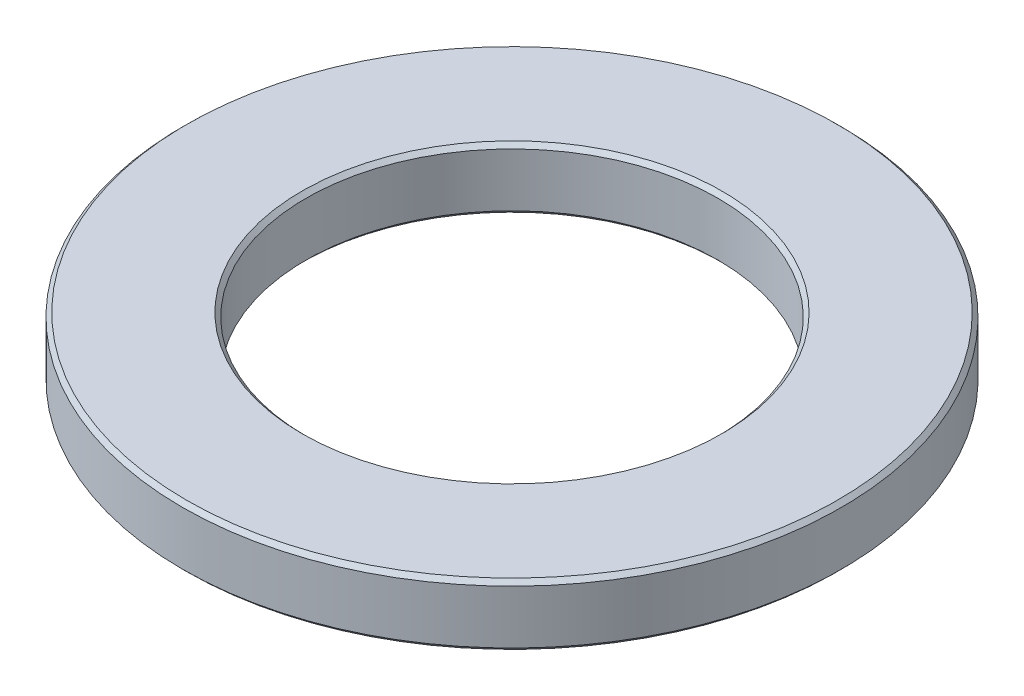
ISO-10303-21;
HEADER;
FILE_DESCRIPTION(('STEP AP214'),'2;1');
FILE_NAME('part.step','',(''),(''),'','','');
FILE_SCHEMA(('AUTOMOTIVE_DESIGN { 1 0 10303 214 1 1 1 1 }'));
ENDSEC;
DATA;
#1=APPLICATION_CONTEXT('core data for automotive mechanical design processes');
#2=APPLICATION_PROTOCOL_DEFINITION('international standard','automotive_design',2000,#1);
#3=PRODUCT_CONTEXT('',#1,'mechanical');
#4=PRODUCT('Part','Part','',(#3));
#5=PRODUCT_RELATED_PRODUCT_CATEGORY('part','',(#4));
#6=PRODUCT_DEFINITION_FORMATION('','',#4);
#7=PRODUCT_DEFINITION_CONTEXT('part definition',#1,'design');
#8=PRODUCT_DEFINITION('design','',#6,#7);
#9=PRODUCT_DEFINITION_SHAPE('','',#8);
#10=(LENGTH_UNIT() NAMED_UNIT(*) SI_UNIT(.MILLI.,.METRE.));
#11=(NAMED_UNIT(*) PLANE_ANGLE_UNIT() SI_UNIT($,.RADIAN.));
#12=(NAMED_UNIT(*) SI_UNIT($,.STERADIAN.) SOLID_ANGLE_UNIT());
#13=UNCERTAINTY_MEASURE_WITH_UNIT(LENGTH_MEASURE(1.E-05),#10,'distance_accuracy_value','');
#14=(GEOMETRIC_REPRESENTATION_CONTEXT(3) GLOBAL_UNCERTAINTY_ASSIGNED_CONTEXT((#13)) GLOBAL_UNIT_ASSIGNED_CONTEXT((#10,
#11,#12)) REPRESENTATION_CONTEXT('',''));
#15=CARTESIAN_POINT('',(0.,0.,0.));
#16=DIRECTION('',(0.,0.,1.));
#17=DIRECTION('',(1.,0.,0.));
#18=AXIS2_PLACEMENT_3D('',#15,#16,#17);
#19=CARTESIAN_POINT('',(0.,1.5,0.));
#20=DIRECTION('',(0.,1.,0.));
#21=DIRECTION('',(0.,0.,1.));
#22=AXIS2_PLACEMENT_3D('',#19,#20,#21);
#23=PLANE('',#22);
#24=CARTESIAN_POINT('',(0.,1.5,0.));
#25=DIRECTION('',(0.,1.,0.));
#26=DIRECTION('',(0.,0.,1.));
#27=AXIS2_PLACEMENT_3D('',#24,#25,#26);
#28=CIRCLE('',#27,5.1);
#29=CARTESIAN_POINT('',(0.,1.5,5.1));
#30=VERTEX_POINT('',#29);
#31=EDGE_CURVE('E10',#30,#30,#28,.F.);
#32=ORIENTED_EDGE('',*,*,#31,.T.);
#33=EDGE_LOOP('',(#32));
#34=FACE_BOUND('',#33,.T.);
#35=CARTESIAN_POINT('',(0.,1.5,0.));
#36=DIRECTION('',(0.,1.,0.));
#37=DIRECTION('',(0.,0.,1.));
#38=AXIS2_PLACEMENT_3D('',#35,#36,#37);
#39=CIRCLE('',#38,7.9);
#40=CARTESIAN_POINT('',(0.,1.5,7.9));
#41=VERTEX_POINT('',#40);
#42=EDGE_CURVE('E52',#41,#41,#39,.T.);
#43=ORIENTED_EDGE('',*,*,#42,.T.);
#44=EDGE_LOOP('',(#43));
#45=FACE_BOUND('',#44,.T.);
#46=ADVANCED_FACE('F32',(#34,#45),#23,.T.);
#47=CARTESIAN_POINT('',(0.,0.,0.));
#48=DIRECTION('',(0.,1.,0.));
#49=DIRECTION('',(0.,0.,1.));
#50=AXIS2_PLACEMENT_3D('',#47,#48,#49);
#51=PLANE('',#50);
#52=CARTESIAN_POINT('',(0.,0.,0.));
#53=DIRECTION('',(0.,1.,0.));
#54=DIRECTION('',(0.,0.,1.));
#55=AXIS2_PLACEMENT_3D('',#52,#53,#54);
#56=CIRCLE('',#55,5.1);
#57=CARTESIAN_POINT('',(0.,0.,5.1));
#58=VERTEX_POINT('',#57);
#59=EDGE_CURVE('E47',#58,#58,#56,.T.);
#60=ORIENTED_EDGE('',*,*,#59,.T.);
#61=EDGE_LOOP('',(#60));
#62=FACE_BOUND('',#61,.T.);
#63=CARTESIAN_POINT('',(0.,0.,0.));
#64=DIRECTION('',(0.,1.,0.));
#65=DIRECTION('',(0.,0.,1.));
#66=AXIS2_PLACEMENT_3D('',#63,#64,#65);
#67=CIRCLE('',#66,7.9);
#68=CARTESIAN_POINT('',(0.,0.,7.9));
#69=VERTEX_POINT('',#68);
#70=EDGE_CURVE('E55',#69,#69,#67,.F.);
#71=ORIENTED_EDGE('',*,*,#70,.T.);
#72=EDGE_LOOP('',(#71));
#73=FACE_BOUND('',#72,.T.);
#74=ADVANCED_FACE('F76',(#62,#73),#51,.F.);
#75=CARTESIAN_POINT('',(0.,1.5,0.));
#76=DIRECTION('',(0.,-1.,0.));
#77=DIRECTION('',(0.,0.,-1.));
#78=AXIS2_PLACEMENT_3D('',#75,#76,#77);
#79=CYLINDRICAL_SURFACE('',#78,8.);
#80=CARTESIAN_POINT('',(0.,0.100000000000001,0.));
#81=DIRECTION('',(0.,1.,0.));
#82=DIRECTION('',(0.,0.,1.));
#83=AXIS2_PLACEMENT_3D('',#80,#81,#82);
#84=CIRCLE('',#83,8.);
#85=CARTESIAN_POINT('',(0.,0.100000000000001,8.));
#86=VERTEX_POINT('',#85);
#87=EDGE_CURVE('E58',#86,#86,#84,.T.);
#88=ORIENTED_EDGE('',*,*,#87,.T.);
#89=EDGE_LOOP('',(#88));
#90=FACE_BOUND('',#89,.T.);
#91=CARTESIAN_POINT('',(0.,1.40000000000001,0.));
#92=DIRECTION('',(0.,1.,0.));
#93=DIRECTION('',(0.,0.,1.));
#94=AXIS2_PLACEMENT_3D('',#91,#92,#93);
#95=CIRCLE('',#94,8.);
#96=CARTESIAN_POINT('',(0.,1.40000000000001,8.));
#97=VERTEX_POINT('',#96);
#98=EDGE_CURVE('E61',#97,#97,#95,.F.);
#99=ORIENTED_EDGE('',*,*,#98,.T.);
#100=EDGE_LOOP('',(#99));
#101=FACE_BOUND('',#100,.T.);
#102=ADVANCED_FACE('F65',(#90,#101),#79,.T.);
#103=CARTESIAN_POINT('',(0.,1.5,0.));
#104=DIRECTION('',(0.,-1.,0.));
#105=DIRECTION('',(0.,0.,-1.));
#106=AXIS2_PLACEMENT_3D('',#103,#104,#105);
#107=CYLINDRICAL_SURFACE('',#106,5.);
#108=CARTESIAN_POINT('',(0.,0.1,0.));
#109=DIRECTION('',(0.,1.,0.));
#110=DIRECTION('',(0.,0.,1.));
#111=AXIS2_PLACEMENT_3D('',#108,#109,#110);
#112=CIRCLE('',#111,5.);
#113=CARTESIAN_POINT('',(0.,0.1,5.));
#114=VERTEX_POINT('',#113);
#115=EDGE_CURVE('E39',#114,#114,#112,.F.);
#116=ORIENTED_EDGE('',*,*,#115,.T.);
#117=EDGE_LOOP('',(#116));
#118=FACE_BOUND('',#117,.T.);
#119=CARTESIAN_POINT('',(0.,1.4,0.));
#120=DIRECTION('',(0.,1.,0.));
#121=DIRECTION('',(0.,0.,1.));
#122=AXIS2_PLACEMENT_3D('',#119,#120,#121);
#123=CIRCLE('',#122,5.);
#124=CARTESIAN_POINT('',(0.,1.4,5.));
#125=VERTEX_POINT('',#124);
#126=EDGE_CURVE('E43',#125,#125,#123,.T.);
#127=ORIENTED_EDGE('',*,*,#126,.T.);
#128=EDGE_LOOP('',(#127));
#129=FACE_BOUND('',#128,.T.);
#130=ADVANCED_FACE('F84',(#118,#129),#107,.F.);
#131=CARTESIAN_POINT('',(0.,0.100000000000001,0.));
#132=DIRECTION('',(0.,1.,0.));
#133=DIRECTION('',(0.,0.,1.));
#134=AXIS2_PLACEMENT_3D('',#131,#132,#133);
#135=CONICAL_SURFACE('',#134,8.,0.785398163397448);
#136=ORIENTED_EDGE('',*,*,#70,.F.);
#137=EDGE_LOOP('',(#136));
#138=FACE_BOUND('',#137,.T.);
#139=ORIENTED_EDGE('',*,*,#87,.F.);
#140=EDGE_LOOP('',(#139));
#141=FACE_BOUND('',#140,.T.);
#142=ADVANCED_FACE('F71',(#138,#141),#135,.T.);
#143=CARTESIAN_POINT('',(0.,1.5,0.));
#144=DIRECTION('',(0.,-1.,0.));
#145=DIRECTION('',(0.,0.,-1.));
#146=AXIS2_PLACEMENT_3D('',#143,#144,#145);
#147=CONICAL_SURFACE('',#146,7.9,0.785398163397466);
#148=ORIENTED_EDGE('',*,*,#98,.F.);
#149=EDGE_LOOP('',(#148));
#150=FACE_BOUND('',#149,.T.);
#151=ORIENTED_EDGE('',*,*,#42,.F.);
#152=EDGE_LOOP('',(#151));
#153=FACE_BOUND('',#152,.T.);
#154=ADVANCED_FACE('F67',(#150,#153),#147,.T.);
#155=CARTESIAN_POINT('',(0.,0.,0.));
#156=DIRECTION('',(0.,-1.,0.));
#157=DIRECTION('',(0.,0.,-1.));
#158=AXIS2_PLACEMENT_3D('',#155,#156,#157);
#159=CONICAL_SURFACE('',#158,5.1,0.785398163397448);
#160=ORIENTED_EDGE('',*,*,#115,.F.);
#161=EDGE_LOOP('',(#160));
#162=FACE_BOUND('',#161,.T.);
#163=ORIENTED_EDGE('',*,*,#59,.F.);
#164=EDGE_LOOP('',(#163));
#165=FACE_BOUND('',#164,.T.);
#166=ADVANCED_FACE('F70',(#162,#165),#159,.F.);
#167=CARTESIAN_POINT('',(0.,1.4,0.));
#168=DIRECTION('',(0.,1.,0.));
#169=DIRECTION('',(0.,0.,1.));
#170=AXIS2_PLACEMENT_3D('',#167,#168,#169);
#171=CONICAL_SURFACE('',#170,5.,0.785398163397435);
#172=ORIENTED_EDGE('',*,*,#31,.F.);
#173=EDGE_LOOP('',(#172));
#174=FACE_BOUND('',#173,.T.);
#175=ORIENTED_EDGE('',*,*,#126,.F.);
#176=EDGE_LOOP('',(#175));
#177=FACE_BOUND('',#176,.T.);
#178=ADVANCED_FACE('F34',(#174,#177),#171,.F.);
#179=CLOSED_SHELL('',(#46,#74,#102,#130,#142,#154,#166,#178));
#180=MANIFOLD_SOLID_BREP('B2',#179);
#181=ADVANCED_BREP_SHAPE_REPRESENTATION('',(#18,#180),#14);
#182=SHAPE_DEFINITION_REPRESENTATION(#9,#181);
ENDSEC;
END-ISO-10303-21;
